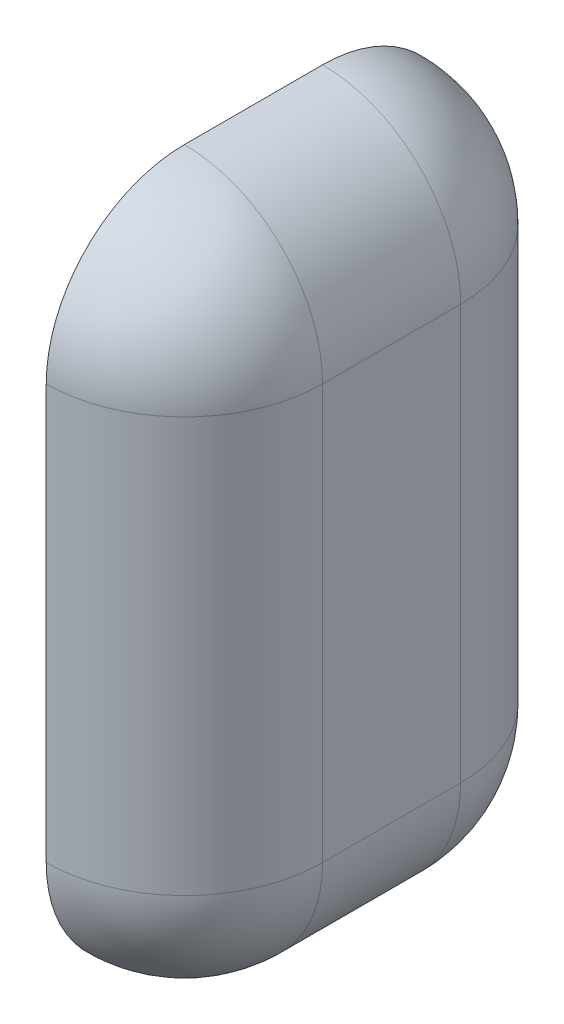
ISO-10303-21;
HEADER;
FILE_DESCRIPTION(('STEP AP214'),'2;1');
FILE_NAME('part.step','',(''),(''),'','','');
FILE_SCHEMA(('AUTOMOTIVE_DESIGN { 1 0 10303 214 1 1 1 1 }'));
ENDSEC;
DATA;
#1=APPLICATION_CONTEXT('core data for automotive mechanical design processes');
#2=APPLICATION_PROTOCOL_DEFINITION('international standard','automotive_design',2000,#1);
#3=PRODUCT_CONTEXT('',#1,'mechanical');
#4=PRODUCT('Part','Part','',(#3));
#5=PRODUCT_RELATED_PRODUCT_CATEGORY('part','',(#4));
#6=PRODUCT_DEFINITION_FORMATION('','',#4);
#7=PRODUCT_DEFINITION_CONTEXT('part definition',#1,'design');
#8=PRODUCT_DEFINITION('design','',#6,#7);
#9=PRODUCT_DEFINITION_SHAPE('','',#8);
#10=(LENGTH_UNIT() NAMED_UNIT(*) SI_UNIT(.MILLI.,.METRE.));
#11=(NAMED_UNIT(*) PLANE_ANGLE_UNIT() SI_UNIT($,.RADIAN.));
#12=(NAMED_UNIT(*) SI_UNIT($,.STERADIAN.) SOLID_ANGLE_UNIT());
#13=UNCERTAINTY_MEASURE_WITH_UNIT(LENGTH_MEASURE(1.E-05),#10,'distance_accuracy_value','');
#14=(GEOMETRIC_REPRESENTATION_CONTEXT(3) GLOBAL_UNCERTAINTY_ASSIGNED_CONTEXT((#13)) GLOBAL_UNIT_ASSIGNED_CONTEXT((#10,
#11,#12)) REPRESENTATION_CONTEXT('',''));
#15=CARTESIAN_POINT('',(0.,0.,0.));
#16=DIRECTION('',(0.,0.,1.));
#17=DIRECTION('',(1.,0.,0.));
#18=AXIS2_PLACEMENT_3D('',#15,#16,#17);
#19=CARTESIAN_POINT('',(0.635,-0.9525,0.4445));
#20=DIRECTION('',(0.,0.,-1.));
#21=DIRECTION('',(-1.,0.,0.));
#22=AXIS2_PLACEMENT_3D('',#19,#20,#21);
#23=PLANE('',#22);
#24=DIRECTION('',(0.,-1.,0.));
#25=VECTOR('',#24,1.);
#26=CARTESIAN_POINT('',(0.,-0.9525,0.4445));
#27=LINE('',#26,#25);
#28=CARTESIAN_POINT('',(0.,0.9525,0.4445));
#29=VERTEX_POINT('',#28);
#30=CARTESIAN_POINT('',(0.,-0.9525,0.4445));
#31=VERTEX_POINT('',#30);
#32=EDGE_CURVE('E160',#29,#31,#27,.T.);
#33=ORIENTED_EDGE('',*,*,#32,.T.);
#34=DIRECTION('',(-1.,0.,0.));
#35=VECTOR('',#34,1.);
#36=CARTESIAN_POINT('',(0.635,-0.9525,0.4445));
#37=LINE('',#36,#35);
#38=CARTESIAN_POINT('',(0.635,-0.9525,0.4445));
#39=VERTEX_POINT('',#38);
#40=EDGE_CURVE('E134',#39,#31,#37,.T.);
#41=ORIENTED_EDGE('',*,*,#40,.F.);
#42=DIRECTION('',(0.,-1.,0.));
#43=VECTOR('',#42,1.);
#44=CARTESIAN_POINT('',(0.635,-0.9525,0.4445));
#45=LINE('',#44,#43);
#46=CARTESIAN_POINT('',(0.635,0.9525,0.4445));
#47=VERTEX_POINT('',#46);
#48=EDGE_CURVE('E128',#47,#39,#45,.T.);
#49=ORIENTED_EDGE('',*,*,#48,.F.);
#50=DIRECTION('',(-1.,0.,0.));
#51=VECTOR('',#50,1.);
#52=CARTESIAN_POINT('',(0.635,0.9525,0.4445));
#53=LINE('',#52,#51);
#54=EDGE_CURVE('E131',#47,#29,#53,.T.);
#55=ORIENTED_EDGE('',*,*,#54,.T.);
#56=EDGE_LOOP('',(#33,#41,#49,#55));
#57=FACE_BOUND('',#56,.T.);
#58=ADVANCED_FACE('F34',(#57),#23,.F.);
#59=CARTESIAN_POINT('',(0.635,-1.2065,0.254));
#60=DIRECTION('',(0.,0.6,-0.8));
#61=DIRECTION('',(0.,0.8,0.6));
#62=AXIS2_PLACEMENT_3D('',#59,#60,#61);
#63=PLANE('',#62);
#64=DIRECTION('',(0.,-0.8,-0.6));
#65=VECTOR('',#64,1.);
#66=CARTESIAN_POINT('',(0.,-1.2065,0.254));
#67=LINE('',#66,#65);
#68=CARTESIAN_POINT('',(0.,-1.2065,0.254));
#69=VERTEX_POINT('',#68);
#70=EDGE_CURVE('E162',#31,#69,#67,.T.);
#71=ORIENTED_EDGE('',*,*,#70,.T.);
#72=DIRECTION('',(-1.,0.,0.));
#73=VECTOR('',#72,1.);
#74=CARTESIAN_POINT('',(0.635,-1.2065,0.254));
#75=LINE('',#74,#73);
#76=CARTESIAN_POINT('',(0.635,-1.2065,0.254));
#77=VERTEX_POINT('',#76);
#78=EDGE_CURVE('E179',#77,#69,#75,.T.);
#79=ORIENTED_EDGE('',*,*,#78,.F.);
#80=DIRECTION('',(0.,-0.8,-0.6));
#81=VECTOR('',#80,1.);
#82=CARTESIAN_POINT('',(0.635,-1.2065,0.254));
#83=LINE('',#82,#81);
#84=EDGE_CURVE('E138',#39,#77,#83,.T.);
#85=ORIENTED_EDGE('',*,*,#84,.F.);
#86=ORIENTED_EDGE('',*,*,#40,.T.);
#87=EDGE_LOOP('',(#71,#79,#85,#86));
#88=FACE_BOUND('',#87,.T.);
#89=ADVANCED_FACE('F250',(#88),#63,.F.);
#90=CARTESIAN_POINT('',(0.635,-1.2065,-0.254));
#91=DIRECTION('',(0.,1.,0.));
#92=DIRECTION('',(0.,0.,1.));
#93=AXIS2_PLACEMENT_3D('',#90,#91,#92);
#94=PLANE('',#93);
#95=DIRECTION('',(0.,0.,-1.));
#96=VECTOR('',#95,1.);
#97=CARTESIAN_POINT('',(0.,-1.2065,-0.254));
#98=LINE('',#97,#96);
#99=CARTESIAN_POINT('',(0.,-1.2065,-0.254));
#100=VERTEX_POINT('',#99);
#101=EDGE_CURVE('E165',#69,#100,#98,.T.);
#102=ORIENTED_EDGE('',*,*,#101,.T.);
#103=DIRECTION('',(-1.,0.,0.));
#104=VECTOR('',#103,1.);
#105=CARTESIAN_POINT('',(0.635,-1.2065,-0.254));
#106=LINE('',#105,#104);
#107=CARTESIAN_POINT('',(0.635,-1.2065,-0.254));
#108=VERTEX_POINT('',#107);
#109=EDGE_CURVE('E176',#108,#100,#106,.T.);
#110=ORIENTED_EDGE('',*,*,#109,.F.);
#111=DIRECTION('',(0.,0.,-1.));
#112=VECTOR('',#111,1.);
#113=CARTESIAN_POINT('',(0.635,-1.2065,-0.254));
#114=LINE('',#113,#112);
#115=EDGE_CURVE('E236',#77,#108,#114,.T.);
#116=ORIENTED_EDGE('',*,*,#115,.F.);
#117=ORIENTED_EDGE('',*,*,#78,.T.);
#118=EDGE_LOOP('',(#102,#110,#116,#117));
#119=FACE_BOUND('',#118,.T.);
#120=ADVANCED_FACE('F252',(#119),#94,.F.);
#121=CARTESIAN_POINT('',(0.635,-0.9525,-0.4445));
#122=DIRECTION('',(0.,0.6,0.8));
#123=DIRECTION('',(0.,-0.8,0.6));
#124=AXIS2_PLACEMENT_3D('',#121,#122,#123);
#125=PLANE('',#124);
#126=DIRECTION('',(0.,0.8,-0.6));
#127=VECTOR('',#126,1.);
#128=CARTESIAN_POINT('',(0.,-0.9525,-0.4445));
#129=LINE('',#128,#127);
#130=CARTESIAN_POINT('',(0.,-0.9525,-0.4445));
#131=VERTEX_POINT('',#130);
#132=EDGE_CURVE('E167',#100,#131,#129,.T.);
#133=ORIENTED_EDGE('',*,*,#132,.T.);
#134=DIRECTION('',(-1.,0.,0.));
#135=VECTOR('',#134,1.);
#136=CARTESIAN_POINT('',(0.635,-0.9525,-0.4445));
#137=LINE('',#136,#135);
#138=CARTESIAN_POINT('',(0.635,-0.9525,-0.4445));
#139=VERTEX_POINT('',#138);
#140=EDGE_CURVE('E173',#139,#131,#137,.T.);
#141=ORIENTED_EDGE('',*,*,#140,.F.);
#142=DIRECTION('',(0.,0.8,-0.6));
#143=VECTOR('',#142,1.);
#144=CARTESIAN_POINT('',(0.635,-0.9525,-0.4445));
#145=LINE('',#144,#143);
#146=EDGE_CURVE('E156',#108,#139,#145,.T.);
#147=ORIENTED_EDGE('',*,*,#146,.F.);
#148=ORIENTED_EDGE('',*,*,#109,.T.);
#149=EDGE_LOOP('',(#133,#141,#147,#148));
#150=FACE_BOUND('',#149,.T.);
#151=ADVANCED_FACE('F241',(#150),#125,.F.);
#152=CARTESIAN_POINT('',(0.635,0.9525,-0.4445));
#153=DIRECTION('',(0.,0.,1.));
#154=DIRECTION('',(1.,0.,0.));
#155=AXIS2_PLACEMENT_3D('',#152,#153,#154);
#156=PLANE('',#155);
#157=DIRECTION('',(0.,1.,0.));
#158=VECTOR('',#157,1.);
#159=CARTESIAN_POINT('',(0.,0.9525,-0.4445));
#160=LINE('',#159,#158);
#161=CARTESIAN_POINT('',(0.,0.9525,-0.4445));
#162=VERTEX_POINT('',#161);
#163=EDGE_CURVE('E169',#131,#162,#160,.T.);
#164=ORIENTED_EDGE('',*,*,#163,.T.);
#165=DIRECTION('',(-1.,0.,0.));
#166=VECTOR('',#165,1.);
#167=CARTESIAN_POINT('',(0.635,0.9525,-0.4445));
#168=LINE('',#167,#166);
#169=CARTESIAN_POINT('',(0.635,0.9525,-0.4445));
#170=VERTEX_POINT('',#169);
#171=EDGE_CURVE('E148',#170,#162,#168,.T.);
#172=ORIENTED_EDGE('',*,*,#171,.F.);
#173=DIRECTION('',(0.,1.,0.));
#174=VECTOR('',#173,1.);
#175=CARTESIAN_POINT('',(0.635,0.9525,-0.4445));
#176=LINE('',#175,#174);
#177=EDGE_CURVE('E154',#139,#170,#176,.T.);
#178=ORIENTED_EDGE('',*,*,#177,.F.);
#179=ORIENTED_EDGE('',*,*,#140,.T.);
#180=EDGE_LOOP('',(#164,#172,#178,#179));
#181=FACE_BOUND('',#180,.T.);
#182=ADVANCED_FACE('F245',(#181),#156,.F.);
#183=CARTESIAN_POINT('',(0.635,0.9525,0.4445));
#184=DIRECTION('',(0.,-1.,0.));
#185=DIRECTION('',(0.,0.,-1.));
#186=AXIS2_PLACEMENT_3D('',#183,#184,#185);
#187=PLANE('',#186);
#188=DIRECTION('',(0.,0.,1.));
#189=VECTOR('',#188,1.);
#190=CARTESIAN_POINT('',(0.,0.9525,0.4445));
#191=LINE('',#190,#189);
#192=EDGE_CURVE('E139',#162,#29,#191,.T.);
#193=ORIENTED_EDGE('',*,*,#192,.T.);
#194=ORIENTED_EDGE('',*,*,#54,.F.);
#195=DIRECTION('',(0.,0.,1.));
#196=VECTOR('',#195,1.);
#197=CARTESIAN_POINT('',(0.635,0.9525,0.4445));
#198=LINE('',#197,#196);
#199=EDGE_CURVE('E145',#170,#47,#198,.T.);
#200=ORIENTED_EDGE('',*,*,#199,.F.);
#201=ORIENTED_EDGE('',*,*,#171,.T.);
#202=EDGE_LOOP('',(#193,#194,#200,#201));
#203=FACE_BOUND('',#202,.T.);
#204=ADVANCED_FACE('F143',(#203),#187,.F.);
#205=CARTESIAN_POINT('',(0.,0.,0.));
#206=DIRECTION('',(-1.,0.,0.));
#207=DIRECTION('',(0.,0.,1.));
#208=AXIS2_PLACEMENT_3D('',#205,#206,#207);
#209=PLANE('',#208);
#210=ORIENTED_EDGE('',*,*,#32,.F.);
#211=ORIENTED_EDGE('',*,*,#192,.F.);
#212=ORIENTED_EDGE('',*,*,#163,.F.);
#213=ORIENTED_EDGE('',*,*,#132,.F.);
#214=ORIENTED_EDGE('',*,*,#101,.F.);
#215=ORIENTED_EDGE('',*,*,#70,.F.);
#216=EDGE_LOOP('',(#210,#211,#212,#213,#214,#215));
#217=FACE_BOUND('',#216,.T.);
#218=ADVANCED_FACE('F247',(#217),#209,.T.);
#219=CARTESIAN_POINT('',(1.905,0.,0.));
#220=DIRECTION('',(-1.,0.,0.));
#221=DIRECTION('',(0.,0.,1.));
#222=AXIS2_PLACEMENT_3D('',#219,#220,#221);
#223=PLANE('',#222);
#224=DIRECTION('',(0.,0.,1.));
#225=VECTOR('',#224,1.);
#226=CARTESIAN_POINT('',(1.905,1.905,0.));
#227=LINE('',#226,#225);
#228=CARTESIAN_POINT('',(1.905,1.905,-0.635));
#229=VERTEX_POINT('',#228);
#230=CARTESIAN_POINT('',(1.905,1.905,0.634999999999999));
#231=VERTEX_POINT('',#230);
#232=EDGE_CURVE('E183',#229,#231,#227,.T.);
#233=ORIENTED_EDGE('',*,*,#232,.T.);
#234=DIRECTION('',(0.,-1.,0.));
#235=VECTOR('',#234,1.);
#236=CARTESIAN_POINT('',(1.905,0.,0.634999999999999));
#237=LINE('',#236,#235);
#238=CARTESIAN_POINT('',(1.905,-1.905,0.634999999999999));
#239=VERTEX_POINT('',#238);
#240=EDGE_CURVE('E11',#231,#239,#237,.T.);
#241=ORIENTED_EDGE('',*,*,#240,.T.);
#242=DIRECTION('',(0.,0.,-1.));
#243=VECTOR('',#242,1.);
#244=CARTESIAN_POINT('',(1.905,-1.905,0.));
#245=LINE('',#244,#243);
#246=CARTESIAN_POINT('',(1.905,-1.905,-0.635));
#247=VERTEX_POINT('',#246);
#248=EDGE_CURVE('E185',#239,#247,#245,.T.);
#249=ORIENTED_EDGE('',*,*,#248,.T.);
#250=DIRECTION('',(0.,1.,0.));
#251=VECTOR('',#250,1.);
#252=CARTESIAN_POINT('',(1.905,0.,-0.635));
#253=LINE('',#252,#251);
#254=EDGE_CURVE('E43',#247,#229,#253,.T.);
#255=ORIENTED_EDGE('',*,*,#254,.T.);
#256=EDGE_LOOP('',(#233,#241,#249,#255));
#257=FACE_BOUND('',#256,.T.);
#258=ADVANCED_FACE('F318',(#257),#223,.F.);
#259=CARTESIAN_POINT('',(0.635,0.,0.));
#260=DIRECTION('',(-1.,0.,0.));
#261=DIRECTION('',(0.,0.,1.));
#262=AXIS2_PLACEMENT_3D('',#259,#260,#261);
#263=PLANE('',#262);
#264=ORIENTED_EDGE('',*,*,#199,.T.);
#265=ORIENTED_EDGE('',*,*,#48,.T.);
#266=ORIENTED_EDGE('',*,*,#84,.T.);
#267=ORIENTED_EDGE('',*,*,#115,.T.);
#268=ORIENTED_EDGE('',*,*,#146,.T.);
#269=ORIENTED_EDGE('',*,*,#177,.T.);
#270=EDGE_LOOP('',(#264,#265,#266,#267,#268,#269));
#271=FACE_BOUND('',#270,.T.);
#272=DIRECTION('',(0.,-1.,0.));
#273=VECTOR('',#272,1.);
#274=CARTESIAN_POINT('',(0.635,-3.175,1.905));
#275=LINE('',#274,#273);
#276=CARTESIAN_POINT('',(0.635,1.905,1.905));
#277=VERTEX_POINT('',#276);
#278=CARTESIAN_POINT('',(0.635,-1.905,1.905));
#279=VERTEX_POINT('',#278);
#280=EDGE_CURVE('E227',#277,#279,#275,.T.);
#281=ORIENTED_EDGE('',*,*,#280,.F.);
#282=CARTESIAN_POINT('',(0.635,1.905,0.634999999999999));
#283=DIRECTION('',(-1.,0.,0.));
#284=DIRECTION('',(0.,0.,1.));
#285=AXIS2_PLACEMENT_3D('',#282,#283,#284);
#286=CIRCLE('',#285,1.27);
#287=CARTESIAN_POINT('',(0.635,3.175,0.635));
#288=VERTEX_POINT('',#287);
#289=EDGE_CURVE('E193',#277,#288,#286,.T.);
#290=ORIENTED_EDGE('',*,*,#289,.T.);
#291=DIRECTION('',(0.,0.,1.));
#292=VECTOR('',#291,1.);
#293=CARTESIAN_POINT('',(0.635,3.175,1.905));
#294=LINE('',#293,#292);
#295=CARTESIAN_POINT('',(0.635,3.175,-0.634999999999999));
#296=VERTEX_POINT('',#295);
#297=EDGE_CURVE('E224',#296,#288,#294,.T.);
#298=ORIENTED_EDGE('',*,*,#297,.F.);
#299=CARTESIAN_POINT('',(0.635,1.905,-0.635));
#300=DIRECTION('',(-1.,0.,0.));
#301=DIRECTION('',(0.,0.,1.));
#302=AXIS2_PLACEMENT_3D('',#299,#300,#301);
#303=CIRCLE('',#302,1.27);
#304=CARTESIAN_POINT('',(0.635,1.905,-1.905));
#305=VERTEX_POINT('',#304);
#306=EDGE_CURVE('E187',#296,#305,#303,.T.);
#307=ORIENTED_EDGE('',*,*,#306,.T.);
#308=DIRECTION('',(0.,1.,0.));
#309=VECTOR('',#308,1.);
#310=CARTESIAN_POINT('',(0.635,-3.175,-1.905));
#311=LINE('',#310,#309);
#312=CARTESIAN_POINT('',(0.635,-1.905,-1.905));
#313=VERTEX_POINT('',#312);
#314=EDGE_CURVE('E210',#313,#305,#311,.T.);
#315=ORIENTED_EDGE('',*,*,#314,.F.);
#316=CARTESIAN_POINT('',(0.635,-1.905,-0.635));
#317=DIRECTION('',(-1.,0.,0.));
#318=DIRECTION('',(0.,0.,1.));
#319=AXIS2_PLACEMENT_3D('',#316,#317,#318);
#320=CIRCLE('',#319,1.27);
#321=CARTESIAN_POINT('',(0.635,-3.175,-0.634999999999999));
#322=VERTEX_POINT('',#321);
#323=EDGE_CURVE('E189',#313,#322,#320,.T.);
#324=ORIENTED_EDGE('',*,*,#323,.T.);
#325=DIRECTION('',(0.,0.,-1.));
#326=VECTOR('',#325,1.);
#327=CARTESIAN_POINT('',(0.635,-3.175,1.905));
#328=LINE('',#327,#326);
#329=CARTESIAN_POINT('',(0.635,-3.175,0.635));
#330=VERTEX_POINT('',#329);
#331=EDGE_CURVE('E163',#330,#322,#328,.T.);
#332=ORIENTED_EDGE('',*,*,#331,.F.);
#333=CARTESIAN_POINT('',(0.635,-1.905,0.634999999999999));
#334=DIRECTION('',(-1.,0.,0.));
#335=DIRECTION('',(0.,0.,1.));
#336=AXIS2_PLACEMENT_3D('',#333,#334,#335);
#337=CIRCLE('',#336,1.27);
#338=EDGE_CURVE('E191',#330,#279,#337,.T.);
#339=ORIENTED_EDGE('',*,*,#338,.T.);
#340=EDGE_LOOP('',(#281,#290,#298,#307,#315,#324,#332,#339));
#341=FACE_BOUND('',#340,.T.);
#342=ADVANCED_FACE('F150',(#271,#341),#263,.T.);
#343=CARTESIAN_POINT('',(0.635,-1.905,0.));
#344=DIRECTION('',(0.,0.,-1.));
#345=DIRECTION('',(-1.,0.,0.));
#346=AXIS2_PLACEMENT_3D('',#343,#344,#345);
#347=CYLINDRICAL_SURFACE('',#346,1.27);
#348=ORIENTED_EDGE('',*,*,#248,.F.);
#349=CARTESIAN_POINT('',(0.635,-1.905,0.634999999999999));
#350=DIRECTION('',(0.,0.,-1.));
#351=DIRECTION('',(-1.,0.,0.));
#352=AXIS2_PLACEMENT_3D('',#349,#350,#351);
#353=CIRCLE('',#352,1.27);
#354=EDGE_CURVE('E203',#239,#330,#353,.T.);
#355=ORIENTED_EDGE('',*,*,#354,.T.);
#356=ORIENTED_EDGE('',*,*,#331,.T.);
#357=CARTESIAN_POINT('',(0.635,-1.905,-0.635));
#358=DIRECTION('',(0.,0.,-1.));
#359=DIRECTION('',(-1.,0.,0.));
#360=AXIS2_PLACEMENT_3D('',#357,#358,#359);
#361=CIRCLE('',#360,1.27);
#362=EDGE_CURVE('E200',#322,#247,#361,.F.);
#363=ORIENTED_EDGE('',*,*,#362,.T.);
#364=EDGE_LOOP('',(#348,#355,#356,#363));
#365=FACE_BOUND('',#364,.T.);
#366=ADVANCED_FACE('F266',(#365),#347,.T.);
#367=CARTESIAN_POINT('',(0.635,1.905,0.));
#368=DIRECTION('',(0.,0.,1.));
#369=DIRECTION('',(1.,0.,0.));
#370=AXIS2_PLACEMENT_3D('',#367,#368,#369);
#371=CYLINDRICAL_SURFACE('',#370,1.27);
#372=ORIENTED_EDGE('',*,*,#297,.T.);
#373=CARTESIAN_POINT('',(0.635,1.905,0.634999999999999));
#374=DIRECTION('',(0.,0.,1.));
#375=DIRECTION('',(1.,0.,0.));
#376=AXIS2_PLACEMENT_3D('',#373,#374,#375);
#377=CIRCLE('',#376,1.27);
#378=EDGE_CURVE('E197',#288,#231,#377,.F.);
#379=ORIENTED_EDGE('',*,*,#378,.T.);
#380=ORIENTED_EDGE('',*,*,#232,.F.);
#381=CARTESIAN_POINT('',(0.635,1.905,-0.635));
#382=DIRECTION('',(0.,0.,1.));
#383=DIRECTION('',(1.,0.,0.));
#384=AXIS2_PLACEMENT_3D('',#381,#382,#383);
#385=CIRCLE('',#384,1.27);
#386=EDGE_CURVE('E195',#229,#296,#385,.T.);
#387=ORIENTED_EDGE('',*,*,#386,.T.);
#388=EDGE_LOOP('',(#372,#379,#380,#387));
#389=FACE_BOUND('',#388,.T.);
#390=ADVANCED_FACE('F223',(#389),#371,.T.);
#391=CARTESIAN_POINT('',(0.635,-1.905,0.634999999999999));
#392=DIRECTION('',(0.,0.,-1.));
#393=DIRECTION('',(-1.,0.,0.));
#394=AXIS2_PLACEMENT_3D('',#391,#392,#393);
#395=SPHERICAL_SURFACE('',#394,1.27);
#396=ORIENTED_EDGE('',*,*,#338,.F.);
#397=ORIENTED_EDGE('',*,*,#354,.F.);
#398=CARTESIAN_POINT('',(0.635,-1.905,0.634999999999999));
#399=DIRECTION('',(0.,1.,0.));
#400=DIRECTION('',(0.,0.,1.));
#401=AXIS2_PLACEMENT_3D('',#398,#399,#400);
#402=CIRCLE('',#401,1.27);
#403=EDGE_CURVE('E208',#279,#239,#402,.T.);
#404=ORIENTED_EDGE('',*,*,#403,.F.);
#405=EDGE_LOOP('',(#396,#397,#404));
#406=FACE_BOUND('',#405,.T.);
#407=ADVANCED_FACE('F272',(#406),#395,.T.);
#408=CARTESIAN_POINT('',(0.635,0.,0.634999999999999));
#409=DIRECTION('',(0.,-1.,0.));
#410=DIRECTION('',(0.,0.,-1.));
#411=AXIS2_PLACEMENT_3D('',#408,#409,#410);
#412=CYLINDRICAL_SURFACE('',#411,1.27);
#413=ORIENTED_EDGE('',*,*,#403,.T.);
#414=ORIENTED_EDGE('',*,*,#240,.F.);
#415=CARTESIAN_POINT('',(0.635,1.905,0.634999999999999));
#416=DIRECTION('',(0.,1.,0.));
#417=DIRECTION('',(0.,0.,1.));
#418=AXIS2_PLACEMENT_3D('',#415,#416,#417);
#419=CIRCLE('',#418,1.27);
#420=EDGE_CURVE('E206',#277,#231,#419,.T.);
#421=ORIENTED_EDGE('',*,*,#420,.F.);
#422=ORIENTED_EDGE('',*,*,#280,.T.);
#423=EDGE_LOOP('',(#413,#414,#421,#422));
#424=FACE_BOUND('',#423,.T.);
#425=ADVANCED_FACE('F276',(#424),#412,.T.);
#426=CARTESIAN_POINT('',(0.635,1.905,0.634999999999999));
#427=DIRECTION('',(0.,0.,-1.));
#428=DIRECTION('',(-1.,0.,0.));
#429=AXIS2_PLACEMENT_3D('',#426,#427,#428);
#430=SPHERICAL_SURFACE('',#429,1.27);
#431=ORIENTED_EDGE('',*,*,#420,.T.);
#432=ORIENTED_EDGE('',*,*,#378,.F.);
#433=ORIENTED_EDGE('',*,*,#289,.F.);
#434=EDGE_LOOP('',(#431,#432,#433));
#435=FACE_BOUND('',#434,.T.);
#436=ADVANCED_FACE('F273',(#435),#430,.T.);
#437=CARTESIAN_POINT('',(0.635,1.905,-0.635));
#438=DIRECTION('',(0.,0.,1.));
#439=DIRECTION('',(1.,0.,0.));
#440=AXIS2_PLACEMENT_3D('',#437,#438,#439);
#441=SPHERICAL_SURFACE('',#440,1.27);
#442=ORIENTED_EDGE('',*,*,#306,.F.);
#443=ORIENTED_EDGE('',*,*,#386,.F.);
#444=CARTESIAN_POINT('',(0.635,1.905,-0.635));
#445=DIRECTION('',(0.,-1.,0.));
#446=DIRECTION('',(0.,0.,-1.));
#447=AXIS2_PLACEMENT_3D('',#444,#445,#446);
#448=CIRCLE('',#447,1.27);
#449=EDGE_CURVE('E38',#305,#229,#448,.T.);
#450=ORIENTED_EDGE('',*,*,#449,.F.);
#451=EDGE_LOOP('',(#442,#443,#450));
#452=FACE_BOUND('',#451,.T.);
#453=ADVANCED_FACE('F36',(#452),#441,.T.);
#454=CARTESIAN_POINT('',(0.635,0.,-0.635));
#455=DIRECTION('',(0.,1.,0.));
#456=DIRECTION('',(0.,0.,1.));
#457=AXIS2_PLACEMENT_3D('',#454,#455,#456);
#458=CYLINDRICAL_SURFACE('',#457,1.27);
#459=ORIENTED_EDGE('',*,*,#449,.T.);
#460=ORIENTED_EDGE('',*,*,#254,.F.);
#461=CARTESIAN_POINT('',(0.635,-1.905,-0.635));
#462=DIRECTION('',(0.,-1.,0.));
#463=DIRECTION('',(0.,0.,-1.));
#464=AXIS2_PLACEMENT_3D('',#461,#462,#463);
#465=CIRCLE('',#464,1.27);
#466=EDGE_CURVE('E51',#313,#247,#465,.T.);
#467=ORIENTED_EDGE('',*,*,#466,.F.);
#468=ORIENTED_EDGE('',*,*,#314,.T.);
#469=EDGE_LOOP('',(#459,#460,#467,#468));
#470=FACE_BOUND('',#469,.T.);
#471=ADVANCED_FACE('F215',(#470),#458,.T.);
#472=CARTESIAN_POINT('',(0.635,-1.905,-0.635));
#473=DIRECTION('',(0.,0.,1.));
#474=DIRECTION('',(1.,0.,0.));
#475=AXIS2_PLACEMENT_3D('',#472,#473,#474);
#476=SPHERICAL_SURFACE('',#475,1.27);
#477=ORIENTED_EDGE('',*,*,#466,.T.);
#478=ORIENTED_EDGE('',*,*,#362,.F.);
#479=ORIENTED_EDGE('',*,*,#323,.F.);
#480=EDGE_LOOP('',(#477,#478,#479));
#481=FACE_BOUND('',#480,.T.);
#482=ADVANCED_FACE('F284',(#481),#476,.T.);
#483=CLOSED_SHELL('',(#58,#89,#120,#151,#182,#204,#218,#258,#342,#366,#390,#407,#425,#436,#453,
#471,#482));
#484=MANIFOLD_SOLID_BREP('B2',#483);
#485=ADVANCED_BREP_SHAPE_REPRESENTATION('',(#18,#484),#14);
#486=SHAPE_DEFINITION_REPRESENTATION(#9,#485);
ENDSEC;
END-ISO-10303-21;
